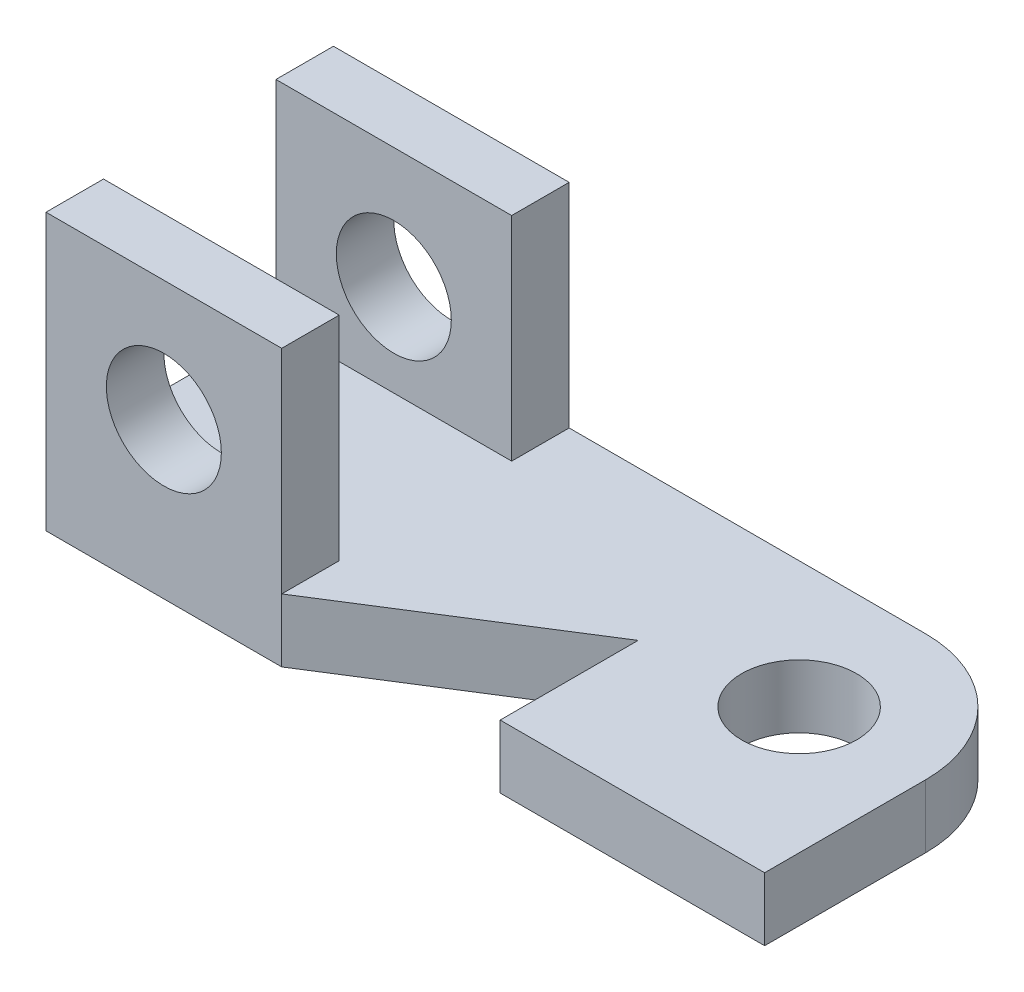
ISO-10303-21;
HEADER;
FILE_DESCRIPTION(('STEP AP214'),'2;1');
FILE_NAME('part.step','',(''),(''),'','','');
FILE_SCHEMA(('AUTOMOTIVE_DESIGN { 1 0 10303 214 1 1 1 1 }'));
ENDSEC;
DATA;
#1=APPLICATION_CONTEXT('core data for automotive mechanical design processes');
#2=APPLICATION_PROTOCOL_DEFINITION('international standard','automotive_design',2000,#1);
#3=PRODUCT_CONTEXT('',#1,'mechanical');
#4=PRODUCT('Part','Part','',(#3));
#5=PRODUCT_RELATED_PRODUCT_CATEGORY('part','',(#4));
#6=PRODUCT_DEFINITION_FORMATION('','',#4);
#7=PRODUCT_DEFINITION_CONTEXT('part definition',#1,'design');
#8=PRODUCT_DEFINITION('design','',#6,#7);
#9=PRODUCT_DEFINITION_SHAPE('','',#8);
#10=(LENGTH_UNIT() NAMED_UNIT(*) SI_UNIT(.MILLI.,.METRE.));
#11=(NAMED_UNIT(*) PLANE_ANGLE_UNIT() SI_UNIT($,.RADIAN.));
#12=(NAMED_UNIT(*) SI_UNIT($,.STERADIAN.) SOLID_ANGLE_UNIT());
#13=UNCERTAINTY_MEASURE_WITH_UNIT(LENGTH_MEASURE(1.E-05),#10,'distance_accuracy_value','');
#14=(GEOMETRIC_REPRESENTATION_CONTEXT(3) GLOBAL_UNCERTAINTY_ASSIGNED_CONTEXT((#13)) GLOBAL_UNIT_ASSIGNED_CONTEXT((#10,
#11,#12)) REPRESENTATION_CONTEXT('',''));
#15=CARTESIAN_POINT('',(0.,0.,0.));
#16=DIRECTION('',(0.,0.,1.));
#17=DIRECTION('',(1.,0.,0.));
#18=AXIS2_PLACEMENT_3D('',#15,#16,#17);
#19=CARTESIAN_POINT('',(103.,11.,-28.));
#20=DIRECTION('',(0.,-1.,0.));
#21=DIRECTION('',(0.,0.,-1.));
#22=AXIS2_PLACEMENT_3D('',#19,#20,#21);
#23=PLANE('',#22);
#24=CARTESIAN_POINT('',(103.,11.,-28.));
#25=DIRECTION('',(0.,1.,0.));
#26=DIRECTION('',(0.,0.,1.));
#27=AXIS2_PLACEMENT_3D('',#24,#25,#26);
#28=CIRCLE('',#27,9.99999999999999);
#29=CARTESIAN_POINT('',(103.,11.,-18.));
#30=VERTEX_POINT('',#29);
#31=EDGE_CURVE('E218',#30,#30,#28,.T.);
#32=ORIENTED_EDGE('',*,*,#31,.F.);
#33=EDGE_LOOP('',(#32));
#34=FACE_BOUND('',#33,.T.);
#35=DIRECTION('',(1.,0.,0.));
#36=VECTOR('',#35,1.);
#37=CARTESIAN_POINT('',(103.,11.,-40.));
#38=LINE('',#37,#36);
#39=CARTESIAN_POINT('',(0.,11.,-40.));
#40=VERTEX_POINT('',#39);
#41=CARTESIAN_POINT('',(41.,11.,-40.));
#42=VERTEX_POINT('',#41);
#43=EDGE_CURVE('E178',#40,#42,#38,.T.);
#44=ORIENTED_EDGE('',*,*,#43,.F.);
#45=DIRECTION('',(0.,0.,1.));
#46=VECTOR('',#45,1.);
#47=CARTESIAN_POINT('',(0.,11.,0.));
#48=LINE('',#47,#46);
#49=CARTESIAN_POINT('',(0.,11.,-10.));
#50=VERTEX_POINT('',#49);
#51=EDGE_CURVE('E245',#40,#50,#48,.T.);
#52=ORIENTED_EDGE('',*,*,#51,.T.);
#53=DIRECTION('',(-1.,0.,0.));
#54=VECTOR('',#53,1.);
#55=CARTESIAN_POINT('',(103.,11.,-10.));
#56=LINE('',#55,#54);
#57=CARTESIAN_POINT('',(41.,11.,-10.));
#58=VERTEX_POINT('',#57);
#59=EDGE_CURVE('E210',#58,#50,#56,.T.);
#60=ORIENTED_EDGE('',*,*,#59,.F.);
#61=DIRECTION('',(0.,0.,-1.));
#62=VECTOR('',#61,1.);
#63=CARTESIAN_POINT('',(41.,11.,-28.));
#64=LINE('',#63,#62);
#65=CARTESIAN_POINT('',(41.,11.,0.));
#66=VERTEX_POINT('',#65);
#67=EDGE_CURVE('E214',#66,#58,#64,.T.);
#68=ORIENTED_EDGE('',*,*,#67,.F.);
#69=DIRECTION('',(0.845488903030971,0.,-0.533992991387982));
#70=VECTOR('',#69,1.);
#71=CARTESIAN_POINT('',(41.,11.,0.));
#72=LINE('',#71,#70);
#73=CARTESIAN_POINT('',(79.,11.,-24.));
#74=VERTEX_POINT('',#73);
#75=EDGE_CURVE('E227',#66,#74,#72,.T.);
#76=ORIENTED_EDGE('',*,*,#75,.T.);
#77=DIRECTION('',(0.,0.,1.));
#78=VECTOR('',#77,1.);
#79=CARTESIAN_POINT('',(79.,11.,-24.));
#80=LINE('',#79,#78);
#81=CARTESIAN_POINT('',(79.,11.,0.));
#82=VERTEX_POINT('',#81);
#83=EDGE_CURVE('E230',#74,#82,#80,.T.);
#84=ORIENTED_EDGE('',*,*,#83,.T.);
#85=DIRECTION('',(1.,0.,0.));
#86=VECTOR('',#85,1.);
#87=CARTESIAN_POINT('',(79.,11.,0.));
#88=LINE('',#87,#86);
#89=CARTESIAN_POINT('',(125.,11.,0.));
#90=VERTEX_POINT('',#89);
#91=EDGE_CURVE('E234',#82,#90,#88,.T.);
#92=ORIENTED_EDGE('',*,*,#91,.T.);
#93=DIRECTION('',(0.,0.,-1.));
#94=VECTOR('',#93,1.);
#95=CARTESIAN_POINT('',(125.,11.,0.));
#96=LINE('',#95,#94);
#97=CARTESIAN_POINT('',(125.,11.,-28.));
#98=VERTEX_POINT('',#97);
#99=EDGE_CURVE('E237',#90,#98,#96,.T.);
#100=ORIENTED_EDGE('',*,*,#99,.T.);
#101=CARTESIAN_POINT('',(103.,11.,-28.));
#102=DIRECTION('',(0.,1.,0.));
#103=DIRECTION('',(0.,0.,-1.));
#104=AXIS2_PLACEMENT_3D('',#101,#102,#103);
#105=CIRCLE('',#104,22.);
#106=CARTESIAN_POINT('',(103.,11.,-50.));
#107=VERTEX_POINT('',#106);
#108=EDGE_CURVE('E240',#98,#107,#105,.T.);
#109=ORIENTED_EDGE('',*,*,#108,.T.);
#110=DIRECTION('',(-1.,0.,0.));
#111=VECTOR('',#110,1.);
#112=CARTESIAN_POINT('',(0.,11.,-50.));
#113=LINE('',#112,#111);
#114=CARTESIAN_POINT('',(41.,11.,-50.));
#115=VERTEX_POINT('',#114);
#116=EDGE_CURVE('E67',#107,#115,#113,.T.);
#117=ORIENTED_EDGE('',*,*,#116,.T.);
#118=DIRECTION('',(0.,0.,-1.));
#119=VECTOR('',#118,1.);
#120=CARTESIAN_POINT('',(41.,11.,-28.));
#121=LINE('',#120,#119);
#122=EDGE_CURVE('E62',#42,#115,#121,.T.);
#123=ORIENTED_EDGE('',*,*,#122,.F.);
#124=EDGE_LOOP('',(#44,#52,#60,#68,#76,#84,#92,#100,#109,#117,#123));
#125=FACE_BOUND('',#124,.T.);
#126=ADVANCED_FACE('F45',(#34,#125),#23,.F.);
#127=CARTESIAN_POINT('',(0.,11.,0.));
#128=DIRECTION('',(0.,0.,-1.));
#129=DIRECTION('',(-1.,0.,0.));
#130=AXIS2_PLACEMENT_3D('',#127,#128,#129);
#131=PLANE('',#130);
#132=CARTESIAN_POINT('',(20.5,27.,0.));
#133=DIRECTION('',(0.,0.,1.));
#134=DIRECTION('',(1.,0.,0.));
#135=AXIS2_PLACEMENT_3D('',#132,#133,#134);
#136=CIRCLE('',#135,10.);
#137=CARTESIAN_POINT('',(30.5,27.,0.));
#138=VERTEX_POINT('',#137);
#139=EDGE_CURVE('E345',#138,#138,#136,.T.);
#140=ORIENTED_EDGE('',*,*,#139,.F.);
#141=EDGE_LOOP('',(#140));
#142=FACE_BOUND('',#141,.T.);
#143=DIRECTION('',(1.,0.,0.));
#144=VECTOR('',#143,1.);
#145=CARTESIAN_POINT('',(0.,0.,0.));
#146=LINE('',#145,#144);
#147=CARTESIAN_POINT('',(0.,0.,0.));
#148=VERTEX_POINT('',#147);
#149=CARTESIAN_POINT('',(41.,0.,0.));
#150=VERTEX_POINT('',#149);
#151=EDGE_CURVE('E223',#148,#150,#146,.T.);
#152=ORIENTED_EDGE('',*,*,#151,.T.);
#153=DIRECTION('',(0.,-1.,0.));
#154=VECTOR('',#153,1.);
#155=CARTESIAN_POINT('',(41.,11.,0.));
#156=LINE('',#155,#154);
#157=EDGE_CURVE('E11',#66,#150,#156,.T.);
#158=ORIENTED_EDGE('',*,*,#157,.F.);
#159=DIRECTION('',(0.,-1.,0.));
#160=VECTOR('',#159,1.);
#161=CARTESIAN_POINT('',(41.,48.,0.));
#162=LINE('',#161,#160);
#163=CARTESIAN_POINT('',(41.,48.,0.));
#164=VERTEX_POINT('',#163);
#165=EDGE_CURVE('E206',#164,#66,#162,.T.);
#166=ORIENTED_EDGE('',*,*,#165,.F.);
#167=DIRECTION('',(1.,0.,0.));
#168=VECTOR('',#167,1.);
#169=CARTESIAN_POINT('',(0.,48.,0.));
#170=LINE('',#169,#168);
#171=CARTESIAN_POINT('',(0.,48.,0.));
#172=VERTEX_POINT('',#171);
#173=EDGE_CURVE('E189',#172,#164,#170,.T.);
#174=ORIENTED_EDGE('',*,*,#173,.F.);
#175=DIRECTION('',(0.,-1.,0.));
#176=VECTOR('',#175,1.);
#177=CARTESIAN_POINT('',(0.,11.,0.));
#178=LINE('',#177,#176);
#179=EDGE_CURVE('E156',#172,#148,#178,.T.);
#180=ORIENTED_EDGE('',*,*,#179,.T.);
#181=EDGE_LOOP('',(#152,#158,#166,#174,#180));
#182=FACE_BOUND('',#181,.T.);
#183=ADVANCED_FACE('F47',(#142,#182),#131,.F.);
#184=CARTESIAN_POINT('',(41.,11.,0.));
#185=DIRECTION('',(-0.533992991387982,0.,-0.845488903030971));
#186=DIRECTION('',(-0.845488903030971,0.,0.533992991387982));
#187=AXIS2_PLACEMENT_3D('',#184,#185,#186);
#188=PLANE('',#187);
#189=DIRECTION('',(0.845488903030971,0.,-0.533992991387982));
#190=VECTOR('',#189,1.);
#191=CARTESIAN_POINT('',(41.,0.,0.));
#192=LINE('',#191,#190);
#193=CARTESIAN_POINT('',(79.,0.,-24.));
#194=VERTEX_POINT('',#193);
#195=EDGE_CURVE('E251',#150,#194,#192,.T.);
#196=ORIENTED_EDGE('',*,*,#195,.T.);
#197=DIRECTION('',(0.,-1.,0.));
#198=VECTOR('',#197,1.);
#199=CARTESIAN_POINT('',(79.,11.,-24.));
#200=LINE('',#199,#198);
#201=EDGE_CURVE('E55',#74,#194,#200,.T.);
#202=ORIENTED_EDGE('',*,*,#201,.F.);
#203=ORIENTED_EDGE('',*,*,#75,.F.);
#204=ORIENTED_EDGE('',*,*,#157,.T.);
#205=EDGE_LOOP('',(#196,#202,#203,#204));
#206=FACE_BOUND('',#205,.T.);
#207=ADVANCED_FACE('F315',(#206),#188,.F.);
#208=CARTESIAN_POINT('',(79.,11.,-24.));
#209=DIRECTION('',(1.,0.,0.));
#210=DIRECTION('',(0.,0.,-1.));
#211=AXIS2_PLACEMENT_3D('',#208,#209,#210);
#212=PLANE('',#211);
#213=DIRECTION('',(0.,0.,1.));
#214=VECTOR('',#213,1.);
#215=CARTESIAN_POINT('',(79.,0.,-24.));
#216=LINE('',#215,#214);
#217=CARTESIAN_POINT('',(79.,0.,0.));
#218=VERTEX_POINT('',#217);
#219=EDGE_CURVE('E254',#194,#218,#216,.T.);
#220=ORIENTED_EDGE('',*,*,#219,.T.);
#221=DIRECTION('',(0.,-1.,0.));
#222=VECTOR('',#221,1.);
#223=CARTESIAN_POINT('',(79.,11.,0.));
#224=LINE('',#223,#222);
#225=EDGE_CURVE('E283',#82,#218,#224,.T.);
#226=ORIENTED_EDGE('',*,*,#225,.F.);
#227=ORIENTED_EDGE('',*,*,#83,.F.);
#228=ORIENTED_EDGE('',*,*,#201,.T.);
#229=EDGE_LOOP('',(#220,#226,#227,#228));
#230=FACE_BOUND('',#229,.T.);
#231=ADVANCED_FACE('F293',(#230),#212,.F.);
#232=CARTESIAN_POINT('',(79.,11.,0.));
#233=DIRECTION('',(0.,0.,-1.));
#234=DIRECTION('',(-1.,0.,0.));
#235=AXIS2_PLACEMENT_3D('',#232,#233,#234);
#236=PLANE('',#235);
#237=DIRECTION('',(1.,0.,0.));
#238=VECTOR('',#237,1.);
#239=CARTESIAN_POINT('',(79.,0.,0.));
#240=LINE('',#239,#238);
#241=CARTESIAN_POINT('',(125.,0.,0.));
#242=VERTEX_POINT('',#241);
#243=EDGE_CURVE('E257',#218,#242,#240,.T.);
#244=ORIENTED_EDGE('',*,*,#243,.T.);
#245=DIRECTION('',(0.,-1.,0.));
#246=VECTOR('',#245,1.);
#247=CARTESIAN_POINT('',(125.,11.,0.));
#248=LINE('',#247,#246);
#249=EDGE_CURVE('E279',#90,#242,#248,.T.);
#250=ORIENTED_EDGE('',*,*,#249,.F.);
#251=ORIENTED_EDGE('',*,*,#91,.F.);
#252=ORIENTED_EDGE('',*,*,#225,.T.);
#253=EDGE_LOOP('',(#244,#250,#251,#252));
#254=FACE_BOUND('',#253,.T.);
#255=ADVANCED_FACE('F306',(#254),#236,.F.);
#256=CARTESIAN_POINT('',(125.,11.,0.));
#257=DIRECTION('',(-1.,0.,0.));
#258=DIRECTION('',(0.,0.,1.));
#259=AXIS2_PLACEMENT_3D('',#256,#257,#258);
#260=PLANE('',#259);
#261=DIRECTION('',(0.,0.,-1.));
#262=VECTOR('',#261,1.);
#263=CARTESIAN_POINT('',(125.,0.,0.));
#264=LINE('',#263,#262);
#265=CARTESIAN_POINT('',(125.,0.,-28.));
#266=VERTEX_POINT('',#265);
#267=EDGE_CURVE('E260',#242,#266,#264,.T.);
#268=ORIENTED_EDGE('',*,*,#267,.T.);
#269=DIRECTION('',(0.,-1.,0.));
#270=VECTOR('',#269,1.);
#271=CARTESIAN_POINT('',(125.,11.,-28.));
#272=LINE('',#271,#270);
#273=EDGE_CURVE('E275',#98,#266,#272,.T.);
#274=ORIENTED_EDGE('',*,*,#273,.F.);
#275=ORIENTED_EDGE('',*,*,#99,.F.);
#276=ORIENTED_EDGE('',*,*,#249,.T.);
#277=EDGE_LOOP('',(#268,#274,#275,#276));
#278=FACE_BOUND('',#277,.T.);
#279=ADVANCED_FACE('F310',(#278),#260,.F.);
#280=CARTESIAN_POINT('',(103.,11.,-28.));
#281=DIRECTION('',(0.,-1.,0.));
#282=DIRECTION('',(0.,0.,-1.));
#283=AXIS2_PLACEMENT_3D('',#280,#281,#282);
#284=CYLINDRICAL_SURFACE('',#283,22.);
#285=CARTESIAN_POINT('',(103.,0.,-28.));
#286=DIRECTION('',(0.,1.,0.));
#287=DIRECTION('',(0.,0.,-1.));
#288=AXIS2_PLACEMENT_3D('',#285,#286,#287);
#289=CIRCLE('',#288,22.);
#290=CARTESIAN_POINT('',(103.,0.,-50.));
#291=VERTEX_POINT('',#290);
#292=EDGE_CURVE('E263',#266,#291,#289,.T.);
#293=ORIENTED_EDGE('',*,*,#292,.T.);
#294=DIRECTION('',(0.,-1.,0.));
#295=VECTOR('',#294,1.);
#296=CARTESIAN_POINT('',(103.,11.,-50.));
#297=LINE('',#296,#295);
#298=EDGE_CURVE('E155',#107,#291,#297,.T.);
#299=ORIENTED_EDGE('',*,*,#298,.F.);
#300=ORIENTED_EDGE('',*,*,#108,.F.);
#301=ORIENTED_EDGE('',*,*,#273,.T.);
#302=EDGE_LOOP('',(#293,#299,#300,#301));
#303=FACE_BOUND('',#302,.T.);
#304=ADVANCED_FACE('F329',(#303),#284,.T.);
#305=CARTESIAN_POINT('',(0.,11.,-50.));
#306=DIRECTION('',(0.,0.,1.));
#307=DIRECTION('',(1.,0.,0.));
#308=AXIS2_PLACEMENT_3D('',#305,#306,#307);
#309=PLANE('',#308);
#310=CARTESIAN_POINT('',(20.5,27.,-50.));
#311=DIRECTION('',(0.,0.,1.));
#312=DIRECTION('',(1.,0.,0.));
#313=AXIS2_PLACEMENT_3D('',#310,#311,#312);
#314=CIRCLE('',#313,10.);
#315=CARTESIAN_POINT('',(30.5,27.,-50.));
#316=VERTEX_POINT('',#315);
#317=EDGE_CURVE('E349',#316,#316,#314,.T.);
#318=ORIENTED_EDGE('',*,*,#317,.T.);
#319=EDGE_LOOP('',(#318));
#320=FACE_BOUND('',#319,.T.);
#321=DIRECTION('',(0.,-1.,0.));
#322=VECTOR('',#321,1.);
#323=CARTESIAN_POINT('',(0.,11.,-50.));
#324=LINE('',#323,#322);
#325=CARTESIAN_POINT('',(0.,48.,-50.));
#326=VERTEX_POINT('',#325);
#327=CARTESIAN_POINT('',(0.,0.,-50.));
#328=VERTEX_POINT('',#327);
#329=EDGE_CURVE('E143',#326,#328,#324,.T.);
#330=ORIENTED_EDGE('',*,*,#329,.F.);
#331=DIRECTION('',(-1.,0.,0.));
#332=VECTOR('',#331,1.);
#333=CARTESIAN_POINT('',(0.,48.,-50.));
#334=LINE('',#333,#332);
#335=CARTESIAN_POINT('',(41.,48.,-50.));
#336=VERTEX_POINT('',#335);
#337=EDGE_CURVE('E147',#336,#326,#334,.T.);
#338=ORIENTED_EDGE('',*,*,#337,.F.);
#339=DIRECTION('',(0.,-1.,0.));
#340=VECTOR('',#339,1.);
#341=CARTESIAN_POINT('',(41.,48.,-50.));
#342=LINE('',#341,#340);
#343=EDGE_CURVE('E167',#336,#115,#342,.T.);
#344=ORIENTED_EDGE('',*,*,#343,.T.);
#345=ORIENTED_EDGE('',*,*,#116,.F.);
#346=ORIENTED_EDGE('',*,*,#298,.T.);
#347=DIRECTION('',(-1.,0.,0.));
#348=VECTOR('',#347,1.);
#349=CARTESIAN_POINT('',(0.,0.,-50.));
#350=LINE('',#349,#348);
#351=EDGE_CURVE('E150',#291,#328,#350,.T.);
#352=ORIENTED_EDGE('',*,*,#351,.T.);
#353=EDGE_LOOP('',(#330,#338,#344,#345,#346,#352));
#354=FACE_BOUND('',#353,.T.);
#355=ADVANCED_FACE('F145',(#320,#354),#309,.F.);
#356=CARTESIAN_POINT('',(0.,11.,0.));
#357=DIRECTION('',(1.,0.,0.));
#358=DIRECTION('',(0.,0.,-1.));
#359=AXIS2_PLACEMENT_3D('',#356,#357,#358);
#360=PLANE('',#359);
#361=DIRECTION('',(0.,0.,1.));
#362=VECTOR('',#361,1.);
#363=CARTESIAN_POINT('',(0.,0.,0.));
#364=LINE('',#363,#362);
#365=EDGE_CURVE('E231',#328,#148,#364,.T.);
#366=ORIENTED_EDGE('',*,*,#365,.T.);
#367=ORIENTED_EDGE('',*,*,#179,.F.);
#368=DIRECTION('',(0.,0.,1.));
#369=VECTOR('',#368,1.);
#370=CARTESIAN_POINT('',(0.,48.,0.));
#371=LINE('',#370,#369);
#372=CARTESIAN_POINT('',(0.,48.,-10.));
#373=VERTEX_POINT('',#372);
#374=EDGE_CURVE('E185',#373,#172,#371,.T.);
#375=ORIENTED_EDGE('',*,*,#374,.F.);
#376=DIRECTION('',(0.,-1.,0.));
#377=VECTOR('',#376,1.);
#378=CARTESIAN_POINT('',(0.,48.,-10.));
#379=LINE('',#378,#377);
#380=EDGE_CURVE('E198',#373,#50,#379,.T.);
#381=ORIENTED_EDGE('',*,*,#380,.T.);
#382=ORIENTED_EDGE('',*,*,#51,.F.);
#383=DIRECTION('',(0.,-1.,0.));
#384=VECTOR('',#383,1.);
#385=CARTESIAN_POINT('',(0.,48.,-40.));
#386=LINE('',#385,#384);
#387=CARTESIAN_POINT('',(0.,48.,-40.));
#388=VERTEX_POINT('',#387);
#389=EDGE_CURVE('E172',#388,#40,#386,.T.);
#390=ORIENTED_EDGE('',*,*,#389,.F.);
#391=DIRECTION('',(0.,0.,1.));
#392=VECTOR('',#391,1.);
#393=CARTESIAN_POINT('',(0.,48.,-50.));
#394=LINE('',#393,#392);
#395=EDGE_CURVE('E161',#326,#388,#394,.T.);
#396=ORIENTED_EDGE('',*,*,#395,.F.);
#397=ORIENTED_EDGE('',*,*,#329,.T.);
#398=EDGE_LOOP('',(#366,#367,#375,#381,#382,#390,#396,#397));
#399=FACE_BOUND('',#398,.T.);
#400=ADVANCED_FACE('F169',(#399),#360,.F.);
#401=CARTESIAN_POINT('',(103.,0.,-28.));
#402=DIRECTION('',(0.,-1.,0.));
#403=DIRECTION('',(0.,0.,-1.));
#404=AXIS2_PLACEMENT_3D('',#401,#402,#403);
#405=PLANE('',#404);
#406=ORIENTED_EDGE('',*,*,#151,.F.);
#407=ORIENTED_EDGE('',*,*,#365,.F.);
#408=ORIENTED_EDGE('',*,*,#351,.F.);
#409=ORIENTED_EDGE('',*,*,#292,.F.);
#410=ORIENTED_EDGE('',*,*,#267,.F.);
#411=ORIENTED_EDGE('',*,*,#243,.F.);
#412=ORIENTED_EDGE('',*,*,#219,.F.);
#413=ORIENTED_EDGE('',*,*,#195,.F.);
#414=EDGE_LOOP('',(#406,#407,#408,#409,#410,#411,#412,#413));
#415=FACE_BOUND('',#414,.T.);
#416=CARTESIAN_POINT('',(103.,0.,-28.));
#417=DIRECTION('',(0.,1.,0.));
#418=DIRECTION('',(0.,0.,1.));
#419=AXIS2_PLACEMENT_3D('',#416,#417,#418);
#420=CIRCLE('',#419,9.99999999999999);
#421=CARTESIAN_POINT('',(103.,0.,-18.));
#422=VERTEX_POINT('',#421);
#423=EDGE_CURVE('E219',#422,#422,#420,.T.);
#424=ORIENTED_EDGE('',*,*,#423,.T.);
#425=EDGE_LOOP('',(#424));
#426=FACE_BOUND('',#425,.T.);
#427=ADVANCED_FACE('F300',(#415,#426),#405,.T.);
#428=CARTESIAN_POINT('',(103.,0.,-28.));
#429=DIRECTION('',(0.,1.,0.));
#430=DIRECTION('',(0.,0.,1.));
#431=AXIS2_PLACEMENT_3D('',#428,#429,#430);
#432=CYLINDRICAL_SURFACE('',#431,9.99999999999999);
#433=ORIENTED_EDGE('',*,*,#423,.F.);
#434=EDGE_LOOP('',(#433));
#435=FACE_BOUND('',#434,.T.);
#436=ORIENTED_EDGE('',*,*,#31,.T.);
#437=EDGE_LOOP('',(#436));
#438=FACE_BOUND('',#437,.T.);
#439=ADVANCED_FACE('F387',(#435,#438),#432,.F.);
#440=CARTESIAN_POINT('',(41.,48.,0.));
#441=DIRECTION('',(-1.,0.,0.));
#442=DIRECTION('',(0.,0.,1.));
#443=AXIS2_PLACEMENT_3D('',#440,#441,#442);
#444=PLANE('',#443);
#445=ORIENTED_EDGE('',*,*,#165,.T.);
#446=ORIENTED_EDGE('',*,*,#67,.T.);
#447=DIRECTION('',(0.,-1.,0.));
#448=VECTOR('',#447,1.);
#449=CARTESIAN_POINT('',(41.,48.,-10.));
#450=LINE('',#449,#448);
#451=CARTESIAN_POINT('',(41.,48.,-10.));
#452=VERTEX_POINT('',#451);
#453=EDGE_CURVE('E202',#452,#58,#450,.T.);
#454=ORIENTED_EDGE('',*,*,#453,.F.);
#455=DIRECTION('',(0.,0.,-1.));
#456=VECTOR('',#455,1.);
#457=CARTESIAN_POINT('',(41.,48.,0.));
#458=LINE('',#457,#456);
#459=EDGE_CURVE('E192',#164,#452,#458,.T.);
#460=ORIENTED_EDGE('',*,*,#459,.F.);
#461=EDGE_LOOP('',(#445,#446,#454,#460));
#462=FACE_BOUND('',#461,.T.);
#463=ADVANCED_FACE('F321',(#462),#444,.F.);
#464=CARTESIAN_POINT('',(0.,48.,-10.));
#465=DIRECTION('',(0.,0.,1.));
#466=DIRECTION('',(1.,0.,0.));
#467=AXIS2_PLACEMENT_3D('',#464,#465,#466);
#468=PLANE('',#467);
#469=CARTESIAN_POINT('',(20.5,27.,-10.));
#470=DIRECTION('',(0.,0.,1.));
#471=DIRECTION('',(1.,0.,0.));
#472=AXIS2_PLACEMENT_3D('',#469,#470,#471);
#473=CIRCLE('',#472,10.);
#474=CARTESIAN_POINT('',(30.5,27.,-10.));
#475=VERTEX_POINT('',#474);
#476=EDGE_CURVE('E341',#475,#475,#473,.T.);
#477=ORIENTED_EDGE('',*,*,#476,.T.);
#478=EDGE_LOOP('',(#477));
#479=FACE_BOUND('',#478,.T.);
#480=ORIENTED_EDGE('',*,*,#453,.T.);
#481=ORIENTED_EDGE('',*,*,#59,.T.);
#482=ORIENTED_EDGE('',*,*,#380,.F.);
#483=DIRECTION('',(-1.,0.,0.));
#484=VECTOR('',#483,1.);
#485=CARTESIAN_POINT('',(0.,48.,-10.));
#486=LINE('',#485,#484);
#487=EDGE_CURVE('E195',#452,#373,#486,.T.);
#488=ORIENTED_EDGE('',*,*,#487,.F.);
#489=EDGE_LOOP('',(#480,#481,#482,#488));
#490=FACE_BOUND('',#489,.T.);
#491=ADVANCED_FACE('F425',(#479,#490),#468,.F.);
#492=CARTESIAN_POINT('',(0.,48.,0.));
#493=DIRECTION('',(0.,-1.,0.));
#494=DIRECTION('',(0.,0.,-1.));
#495=AXIS2_PLACEMENT_3D('',#492,#493,#494);
#496=PLANE('',#495);
#497=ORIENTED_EDGE('',*,*,#374,.T.);
#498=ORIENTED_EDGE('',*,*,#173,.T.);
#499=ORIENTED_EDGE('',*,*,#459,.T.);
#500=ORIENTED_EDGE('',*,*,#487,.T.);
#501=EDGE_LOOP('',(#497,#498,#499,#500));
#502=FACE_BOUND('',#501,.T.);
#503=ADVANCED_FACE('F325',(#502),#496,.F.);
#504=CARTESIAN_POINT('',(0.,48.,-40.));
#505=DIRECTION('',(0.,0.,-1.));
#506=DIRECTION('',(-1.,0.,0.));
#507=AXIS2_PLACEMENT_3D('',#504,#505,#506);
#508=PLANE('',#507);
#509=CARTESIAN_POINT('',(20.5,27.,-40.));
#510=DIRECTION('',(0.,0.,-1.));
#511=DIRECTION('',(-1.,0.,0.));
#512=AXIS2_PLACEMENT_3D('',#509,#510,#511);
#513=CIRCLE('',#512,10.);
#514=CARTESIAN_POINT('',(10.5,27.,-40.));
#515=VERTEX_POINT('',#514);
#516=EDGE_CURVE('E49',#515,#515,#513,.T.);
#517=ORIENTED_EDGE('',*,*,#516,.T.);
#518=EDGE_LOOP('',(#517));
#519=FACE_BOUND('',#518,.T.);
#520=ORIENTED_EDGE('',*,*,#389,.T.);
#521=ORIENTED_EDGE('',*,*,#43,.T.);
#522=DIRECTION('',(0.,-1.,0.));
#523=VECTOR('',#522,1.);
#524=CARTESIAN_POINT('',(41.,48.,-40.));
#525=LINE('',#524,#523);
#526=CARTESIAN_POINT('',(41.,48.,-40.));
#527=VERTEX_POINT('',#526);
#528=EDGE_CURVE('E332',#527,#42,#525,.T.);
#529=ORIENTED_EDGE('',*,*,#528,.F.);
#530=DIRECTION('',(1.,0.,0.));
#531=VECTOR('',#530,1.);
#532=CARTESIAN_POINT('',(0.,48.,-40.));
#533=LINE('',#532,#531);
#534=EDGE_CURVE('E174',#388,#527,#533,.T.);
#535=ORIENTED_EDGE('',*,*,#534,.F.);
#536=EDGE_LOOP('',(#520,#521,#529,#535));
#537=FACE_BOUND('',#536,.T.);
#538=ADVANCED_FACE('F358',(#519,#537),#508,.F.);
#539=CARTESIAN_POINT('',(41.,48.,-50.));
#540=DIRECTION('',(-1.,0.,0.));
#541=DIRECTION('',(0.,0.,1.));
#542=AXIS2_PLACEMENT_3D('',#539,#540,#541);
#543=PLANE('',#542);
#544=ORIENTED_EDGE('',*,*,#528,.T.);
#545=ORIENTED_EDGE('',*,*,#122,.T.);
#546=ORIENTED_EDGE('',*,*,#343,.F.);
#547=DIRECTION('',(0.,0.,-1.));
#548=VECTOR('',#547,1.);
#549=CARTESIAN_POINT('',(41.,48.,-50.));
#550=LINE('',#549,#548);
#551=EDGE_CURVE('E164',#527,#336,#550,.T.);
#552=ORIENTED_EDGE('',*,*,#551,.F.);
#553=EDGE_LOOP('',(#544,#545,#546,#552));
#554=FACE_BOUND('',#553,.T.);
#555=ADVANCED_FACE('F372',(#554),#543,.F.);
#556=CARTESIAN_POINT('',(0.,48.,0.));
#557=DIRECTION('',(0.,1.,0.));
#558=DIRECTION('',(0.,0.,1.));
#559=AXIS2_PLACEMENT_3D('',#556,#557,#558);
#560=PLANE('',#559);
#561=ORIENTED_EDGE('',*,*,#395,.T.);
#562=ORIENTED_EDGE('',*,*,#534,.T.);
#563=ORIENTED_EDGE('',*,*,#551,.T.);
#564=ORIENTED_EDGE('',*,*,#337,.T.);
#565=EDGE_LOOP('',(#561,#562,#563,#564));
#566=FACE_BOUND('',#565,.T.);
#567=ADVANCED_FACE('F160',(#566),#560,.T.);
#568=CARTESIAN_POINT('',(20.5,27.,-50.));
#569=DIRECTION('',(0.,0.,1.));
#570=DIRECTION('',(1.,0.,0.));
#571=AXIS2_PLACEMENT_3D('',#568,#569,#570);
#572=CYLINDRICAL_SURFACE('',#571,10.);
#573=ORIENTED_EDGE('',*,*,#317,.F.);
#574=EDGE_LOOP('',(#573));
#575=FACE_BOUND('',#574,.T.);
#576=ORIENTED_EDGE('',*,*,#516,.F.);
#577=EDGE_LOOP('',(#576));
#578=FACE_BOUND('',#577,.T.);
#579=ADVANCED_FACE('F361',(#575,#578),#572,.F.);
#580=ORIENTED_EDGE('',*,*,#139,.T.);
#581=EDGE_LOOP('',(#580));
#582=FACE_BOUND('',#581,.T.);
#583=ORIENTED_EDGE('',*,*,#476,.F.);
#584=EDGE_LOOP('',(#583));
#585=FACE_BOUND('',#584,.T.);
#586=ADVANCED_FACE('F363',(#582,#585),#572,.F.);
#587=CLOSED_SHELL('',(#126,#183,#207,#231,#255,#279,#304,#355,#400,#427,#439,#463,#491,#503,
#538,#555,#567,#579,#586));
#588=MANIFOLD_SOLID_BREP('B2',#587);
#589=ADVANCED_BREP_SHAPE_REPRESENTATION('',(#18,#588),#14);
#590=SHAPE_DEFINITION_REPRESENTATION(#9,#589);
ENDSEC;
END-ISO-10303-21;
